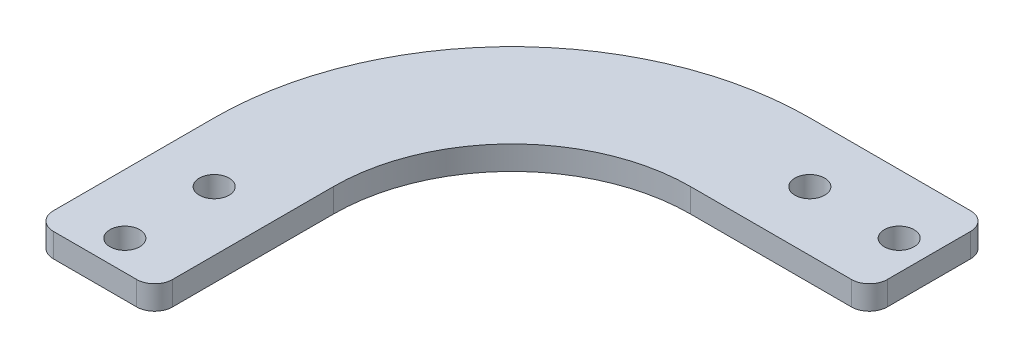
ISO-10303-21;
HEADER;
FILE_DESCRIPTION(('STEP AP214'),'2;1');
FILE_NAME('part.step','',(''),(''),'','','');
FILE_SCHEMA(('AUTOMOTIVE_DESIGN { 1 0 10303 214 1 1 1 1 }'));
ENDSEC;
DATA;
#1=APPLICATION_CONTEXT('core data for automotive mechanical design processes');
#2=APPLICATION_PROTOCOL_DEFINITION('international standard','automotive_design',2000,#1);
#3=PRODUCT_CONTEXT('',#1,'mechanical');
#4=PRODUCT('Part','Part','',(#3));
#5=PRODUCT_RELATED_PRODUCT_CATEGORY('part','',(#4));
#6=PRODUCT_DEFINITION_FORMATION('','',#4);
#7=PRODUCT_DEFINITION_CONTEXT('part definition',#1,'design');
#8=PRODUCT_DEFINITION('design','',#6,#7);
#9=PRODUCT_DEFINITION_SHAPE('','',#8);
#10=(LENGTH_UNIT() NAMED_UNIT(*) SI_UNIT(.MILLI.,.METRE.));
#11=(NAMED_UNIT(*) PLANE_ANGLE_UNIT() SI_UNIT($,.RADIAN.));
#12=(NAMED_UNIT(*) SI_UNIT($,.STERADIAN.) SOLID_ANGLE_UNIT());
#13=UNCERTAINTY_MEASURE_WITH_UNIT(LENGTH_MEASURE(1.E-05),#10,'distance_accuracy_value','');
#14=(GEOMETRIC_REPRESENTATION_CONTEXT(3) GLOBAL_UNCERTAINTY_ASSIGNED_CONTEXT((#13)) GLOBAL_UNIT_ASSIGNED_CONTEXT((#10,
#11,#12)) REPRESENTATION_CONTEXT('',''));
#15=CARTESIAN_POINT('',(0.,0.,0.));
#16=DIRECTION('',(0.,0.,1.));
#17=DIRECTION('',(1.,0.,0.));
#18=AXIS2_PLACEMENT_3D('',#15,#16,#17);
#19=CARTESIAN_POINT('',(0.,4.,0.));
#20=DIRECTION('',(0.,1.,0.));
#21=DIRECTION('',(0.,0.,1.));
#22=AXIS2_PLACEMENT_3D('',#19,#20,#21);
#23=PLANE('',#22);
#24=CARTESIAN_POINT('',(10.,4.,-40.));
#25=DIRECTION('',(0.,1.,0.));
#26=DIRECTION('',(0.,0.,1.));
#27=AXIS2_PLACEMENT_3D('',#24,#25,#26);
#28=CIRCLE('',#27,2.5);
#29=CARTESIAN_POINT('',(10.,4.,-37.5));
#30=VERTEX_POINT('',#29);
#31=EDGE_CURVE('E293',#30,#30,#28,.T.);
#32=ORIENTED_EDGE('',*,*,#31,.F.);
#33=EDGE_LOOP('',(#32));
#34=FACE_BOUND('',#33,.T.);
#35=CARTESIAN_POINT('',(-40.,4.,10.));
#36=DIRECTION('',(0.,1.,0.));
#37=DIRECTION('',(0.,0.,1.));
#38=AXIS2_PLACEMENT_3D('',#35,#36,#37);
#39=CIRCLE('',#38,2.49999999999999);
#40=CARTESIAN_POINT('',(-40.,4.,12.5));
#41=VERTEX_POINT('',#40);
#42=EDGE_CURVE('E160',#41,#41,#39,.T.);
#43=ORIENTED_EDGE('',*,*,#42,.F.);
#44=EDGE_LOOP('',(#43));
#45=FACE_BOUND('',#44,.T.);
#46=CARTESIAN_POINT('',(0.,4.,0.));
#47=DIRECTION('',(0.,1.,0.));
#48=DIRECTION('',(0.,0.,1.));
#49=AXIS2_PLACEMENT_3D('',#46,#47,#48);
#50=CIRCLE('',#49,50.);
#51=CARTESIAN_POINT('',(0.,4.,-50.));
#52=VERTEX_POINT('',#51);
#53=CARTESIAN_POINT('',(-50.,4.,0.));
#54=VERTEX_POINT('',#53);
#55=EDGE_CURVE('E181',#52,#54,#50,.T.);
#56=ORIENTED_EDGE('',*,*,#55,.T.);
#57=DIRECTION('',(0.,0.,1.));
#58=VECTOR('',#57,1.);
#59=CARTESIAN_POINT('',(-50.,4.,0.));
#60=LINE('',#59,#58);
#61=CARTESIAN_POINT('',(-50.,4.,27.));
#62=VERTEX_POINT('',#61);
#63=EDGE_CURVE('E107',#54,#62,#60,.T.);
#64=ORIENTED_EDGE('',*,*,#63,.T.);
#65=CARTESIAN_POINT('',(-47.,4.,27.));
#66=DIRECTION('',(0.,1.,0.));
#67=DIRECTION('',(0.,0.,1.));
#68=AXIS2_PLACEMENT_3D('',#65,#66,#67);
#69=CIRCLE('',#68,3.);
#70=CARTESIAN_POINT('',(-47.,4.,30.));
#71=VERTEX_POINT('',#70);
#72=EDGE_CURVE('E208',#62,#71,#69,.T.);
#73=ORIENTED_EDGE('',*,*,#72,.T.);
#74=DIRECTION('',(1.,0.,0.));
#75=VECTOR('',#74,1.);
#76=CARTESIAN_POINT('',(-47.,4.,30.));
#77=LINE('',#76,#75);
#78=CARTESIAN_POINT('',(-33.,4.,30.));
#79=VERTEX_POINT('',#78);
#80=EDGE_CURVE('E226',#71,#79,#77,.T.);
#81=ORIENTED_EDGE('',*,*,#80,.T.);
#82=CARTESIAN_POINT('',(-33.,4.,27.));
#83=DIRECTION('',(0.,1.,0.));
#84=DIRECTION('',(0.,0.,1.));
#85=AXIS2_PLACEMENT_3D('',#82,#83,#84);
#86=CIRCLE('',#85,3.);
#87=CARTESIAN_POINT('',(-30.,4.,27.));
#88=VERTEX_POINT('',#87);
#89=EDGE_CURVE('E223',#79,#88,#86,.T.);
#90=ORIENTED_EDGE('',*,*,#89,.T.);
#91=DIRECTION('',(0.,0.,-1.));
#92=VECTOR('',#91,1.);
#93=CARTESIAN_POINT('',(-30.,4.,27.));
#94=LINE('',#93,#92);
#95=CARTESIAN_POINT('',(-30.,4.,0.));
#96=VERTEX_POINT('',#95);
#97=EDGE_CURVE('E225',#88,#96,#94,.T.);
#98=ORIENTED_EDGE('',*,*,#97,.T.);
#99=CARTESIAN_POINT('',(0.,4.,0.));
#100=DIRECTION('',(0.,-1.,0.));
#101=DIRECTION('',(0.,0.,1.));
#102=AXIS2_PLACEMENT_3D('',#99,#100,#101);
#103=CIRCLE('',#102,30.);
#104=CARTESIAN_POINT('',(0.,4.,-30.));
#105=VERTEX_POINT('',#104);
#106=EDGE_CURVE('E228',#96,#105,#103,.T.);
#107=ORIENTED_EDGE('',*,*,#106,.T.);
#108=DIRECTION('',(1.,0.,0.));
#109=VECTOR('',#108,1.);
#110=CARTESIAN_POINT('',(0.,4.,-30.));
#111=LINE('',#110,#109);
#112=CARTESIAN_POINT('',(27.,4.,-30.));
#113=VERTEX_POINT('',#112);
#114=EDGE_CURVE('E234',#105,#113,#111,.T.);
#115=ORIENTED_EDGE('',*,*,#114,.T.);
#116=CARTESIAN_POINT('',(27.,4.,-33.));
#117=DIRECTION('',(0.,1.,0.));
#118=DIRECTION('',(0.,0.,-1.));
#119=AXIS2_PLACEMENT_3D('',#116,#117,#118);
#120=CIRCLE('',#119,3.);
#121=CARTESIAN_POINT('',(30.,4.,-33.));
#122=VERTEX_POINT('',#121);
#123=EDGE_CURVE('E138',#113,#122,#120,.T.);
#124=ORIENTED_EDGE('',*,*,#123,.T.);
#125=DIRECTION('',(0.,0.,-1.));
#126=VECTOR('',#125,1.);
#127=CARTESIAN_POINT('',(30.,4.,-47.));
#128=LINE('',#127,#126);
#129=CARTESIAN_POINT('',(30.,4.,-47.));
#130=VERTEX_POINT('',#129);
#131=EDGE_CURVE('E132',#122,#130,#128,.T.);
#132=ORIENTED_EDGE('',*,*,#131,.T.);
#133=CARTESIAN_POINT('',(27.,4.,-47.));
#134=DIRECTION('',(0.,1.,0.));
#135=DIRECTION('',(0.,0.,-1.));
#136=AXIS2_PLACEMENT_3D('',#133,#134,#135);
#137=CIRCLE('',#136,3.);
#138=CARTESIAN_POINT('',(27.,4.,-50.));
#139=VERTEX_POINT('',#138);
#140=EDGE_CURVE('E136',#130,#139,#137,.T.);
#141=ORIENTED_EDGE('',*,*,#140,.T.);
#142=DIRECTION('',(-1.,0.,0.));
#143=VECTOR('',#142,1.);
#144=CARTESIAN_POINT('',(0.,4.,-50.));
#145=LINE('',#144,#143);
#146=EDGE_CURVE('E52',#139,#52,#145,.T.);
#147=ORIENTED_EDGE('',*,*,#146,.T.);
#148=EDGE_LOOP('',(#56,#64,#73,#81,#90,#98,#107,#115,#124,#132,#141,#147));
#149=FACE_BOUND('',#148,.T.);
#150=CARTESIAN_POINT('',(-40.,4.,25.));
#151=DIRECTION('',(0.,1.,0.));
#152=DIRECTION('',(0.,0.,1.));
#153=AXIS2_PLACEMENT_3D('',#150,#151,#152);
#154=CIRCLE('',#153,2.49999999999999);
#155=CARTESIAN_POINT('',(-40.,4.,27.5));
#156=VERTEX_POINT('',#155);
#157=EDGE_CURVE('E299',#156,#156,#154,.T.);
#158=ORIENTED_EDGE('',*,*,#157,.F.);
#159=EDGE_LOOP('',(#158));
#160=FACE_BOUND('',#159,.T.);
#161=CARTESIAN_POINT('',(25.,4.,-40.));
#162=DIRECTION('',(0.,1.,0.));
#163=DIRECTION('',(0.,0.,1.));
#164=AXIS2_PLACEMENT_3D('',#161,#162,#163);
#165=CIRCLE('',#164,2.5);
#166=CARTESIAN_POINT('',(25.,4.,-37.5));
#167=VERTEX_POINT('',#166);
#168=EDGE_CURVE('E284',#167,#167,#165,.T.);
#169=ORIENTED_EDGE('',*,*,#168,.F.);
#170=EDGE_LOOP('',(#169));
#171=FACE_BOUND('',#170,.T.);
#172=ADVANCED_FACE('F35',(#34,#45,#149,#160,#171),#23,.T.);
#173=CARTESIAN_POINT('',(0.,0.,0.));
#174=DIRECTION('',(0.,1.,0.));
#175=DIRECTION('',(0.,0.,1.));
#176=AXIS2_PLACEMENT_3D('',#173,#174,#175);
#177=PLANE('',#176);
#178=CARTESIAN_POINT('',(0.,0.,0.));
#179=DIRECTION('',(0.,1.,0.));
#180=DIRECTION('',(0.,0.,1.));
#181=AXIS2_PLACEMENT_3D('',#178,#179,#180);
#182=CIRCLE('',#181,50.);
#183=CARTESIAN_POINT('',(0.,0.,-50.));
#184=VERTEX_POINT('',#183);
#185=CARTESIAN_POINT('',(-50.,0.,0.));
#186=VERTEX_POINT('',#185);
#187=EDGE_CURVE('E156',#184,#186,#182,.T.);
#188=ORIENTED_EDGE('',*,*,#187,.F.);
#189=DIRECTION('',(-1.,0.,0.));
#190=VECTOR('',#189,1.);
#191=CARTESIAN_POINT('',(0.,0.,-50.));
#192=LINE('',#191,#190);
#193=CARTESIAN_POINT('',(27.,0.,-50.));
#194=VERTEX_POINT('',#193);
#195=EDGE_CURVE('E99',#194,#184,#192,.T.);
#196=ORIENTED_EDGE('',*,*,#195,.F.);
#197=CARTESIAN_POINT('',(27.,0.,-47.));
#198=DIRECTION('',(0.,1.,0.));
#199=DIRECTION('',(0.,0.,-1.));
#200=AXIS2_PLACEMENT_3D('',#197,#198,#199);
#201=CIRCLE('',#200,3.);
#202=CARTESIAN_POINT('',(30.,0.,-47.));
#203=VERTEX_POINT('',#202);
#204=EDGE_CURVE('E93',#203,#194,#201,.T.);
#205=ORIENTED_EDGE('',*,*,#204,.F.);
#206=DIRECTION('',(0.,0.,-1.));
#207=VECTOR('',#206,1.);
#208=CARTESIAN_POINT('',(30.,0.,-47.));
#209=LINE('',#208,#207);
#210=CARTESIAN_POINT('',(30.,0.,-33.));
#211=VERTEX_POINT('',#210);
#212=EDGE_CURVE('E146',#211,#203,#209,.T.);
#213=ORIENTED_EDGE('',*,*,#212,.F.);
#214=CARTESIAN_POINT('',(27.,0.,-33.));
#215=DIRECTION('',(0.,1.,0.));
#216=DIRECTION('',(0.,0.,-1.));
#217=AXIS2_PLACEMENT_3D('',#214,#215,#216);
#218=CIRCLE('',#217,3.);
#219=CARTESIAN_POINT('',(27.,0.,-30.));
#220=VERTEX_POINT('',#219);
#221=EDGE_CURVE('E176',#220,#211,#218,.T.);
#222=ORIENTED_EDGE('',*,*,#221,.F.);
#223=DIRECTION('',(1.,0.,0.));
#224=VECTOR('',#223,1.);
#225=CARTESIAN_POINT('',(27.,0.,-30.));
#226=LINE('',#225,#224);
#227=CARTESIAN_POINT('',(0.,0.,-30.));
#228=VERTEX_POINT('',#227);
#229=EDGE_CURVE('E174',#228,#220,#226,.T.);
#230=ORIENTED_EDGE('',*,*,#229,.F.);
#231=CARTESIAN_POINT('',(0.,0.,0.));
#232=DIRECTION('',(0.,-1.,0.));
#233=DIRECTION('',(0.,0.,1.));
#234=AXIS2_PLACEMENT_3D('',#231,#232,#233);
#235=CIRCLE('',#234,30.);
#236=CARTESIAN_POINT('',(-30.,0.,0.));
#237=VERTEX_POINT('',#236);
#238=EDGE_CURVE('E171',#237,#228,#235,.T.);
#239=ORIENTED_EDGE('',*,*,#238,.F.);
#240=DIRECTION('',(0.,0.,-1.));
#241=VECTOR('',#240,1.);
#242=CARTESIAN_POINT('',(-30.,0.,14.1421356237309));
#243=LINE('',#242,#241);
#244=CARTESIAN_POINT('',(-30.,0.,27.));
#245=VERTEX_POINT('',#244);
#246=EDGE_CURVE('E169',#245,#237,#243,.T.);
#247=ORIENTED_EDGE('',*,*,#246,.F.);
#248=CARTESIAN_POINT('',(-33.,0.,27.));
#249=DIRECTION('',(0.,1.,0.));
#250=DIRECTION('',(0.,0.,1.));
#251=AXIS2_PLACEMENT_3D('',#248,#249,#250);
#252=CIRCLE('',#251,3.);
#253=CARTESIAN_POINT('',(-33.,0.,30.));
#254=VERTEX_POINT('',#253);
#255=EDGE_CURVE('E166',#254,#245,#252,.T.);
#256=ORIENTED_EDGE('',*,*,#255,.F.);
#257=DIRECTION('',(1.,0.,0.));
#258=VECTOR('',#257,1.);
#259=CARTESIAN_POINT('',(-47.,0.,30.));
#260=LINE('',#259,#258);
#261=CARTESIAN_POINT('',(-47.,0.,30.));
#262=VERTEX_POINT('',#261);
#263=EDGE_CURVE('E164',#262,#254,#260,.T.);
#264=ORIENTED_EDGE('',*,*,#263,.F.);
#265=CARTESIAN_POINT('',(-47.,0.,27.));
#266=DIRECTION('',(0.,1.,0.));
#267=DIRECTION('',(0.,0.,1.));
#268=AXIS2_PLACEMENT_3D('',#265,#266,#267);
#269=CIRCLE('',#268,3.);
#270=CARTESIAN_POINT('',(-50.,0.,27.));
#271=VERTEX_POINT('',#270);
#272=EDGE_CURVE('E162',#271,#262,#269,.T.);
#273=ORIENTED_EDGE('',*,*,#272,.F.);
#274=DIRECTION('',(0.,0.,1.));
#275=VECTOR('',#274,1.);
#276=CARTESIAN_POINT('',(-50.,0.,0.));
#277=LINE('',#276,#275);
#278=EDGE_CURVE('E159',#186,#271,#277,.T.);
#279=ORIENTED_EDGE('',*,*,#278,.F.);
#280=EDGE_LOOP('',(#188,#196,#205,#213,#222,#230,#239,#247,#256,#264,#273,#279));
#281=FACE_BOUND('',#280,.T.);
#282=CARTESIAN_POINT('',(-40.,0.,10.));
#283=DIRECTION('',(0.,1.,0.));
#284=DIRECTION('',(0.,0.,1.));
#285=AXIS2_PLACEMENT_3D('',#282,#283,#284);
#286=CIRCLE('',#285,2.49999999999999);
#287=CARTESIAN_POINT('',(-40.,0.,12.5));
#288=VERTEX_POINT('',#287);
#289=EDGE_CURVE('E302',#288,#288,#286,.T.);
#290=ORIENTED_EDGE('',*,*,#289,.T.);
#291=EDGE_LOOP('',(#290));
#292=FACE_BOUND('',#291,.T.);
#293=CARTESIAN_POINT('',(-40.,0.,25.));
#294=DIRECTION('',(0.,1.,0.));
#295=DIRECTION('',(0.,0.,1.));
#296=AXIS2_PLACEMENT_3D('',#293,#294,#295);
#297=CIRCLE('',#296,2.49999999999999);
#298=CARTESIAN_POINT('',(-40.,0.,27.5));
#299=VERTEX_POINT('',#298);
#300=EDGE_CURVE('E296',#299,#299,#297,.T.);
#301=ORIENTED_EDGE('',*,*,#300,.T.);
#302=EDGE_LOOP('',(#301));
#303=FACE_BOUND('',#302,.T.);
#304=CARTESIAN_POINT('',(10.,0.,-40.));
#305=DIRECTION('',(0.,1.,0.));
#306=DIRECTION('',(0.,0.,1.));
#307=AXIS2_PLACEMENT_3D('',#304,#305,#306);
#308=CIRCLE('',#307,2.5);
#309=CARTESIAN_POINT('',(10.,0.,-37.5));
#310=VERTEX_POINT('',#309);
#311=EDGE_CURVE('E290',#310,#310,#308,.T.);
#312=ORIENTED_EDGE('',*,*,#311,.T.);
#313=EDGE_LOOP('',(#312));
#314=FACE_BOUND('',#313,.T.);
#315=CARTESIAN_POINT('',(25.,0.,-40.));
#316=DIRECTION('',(0.,1.,0.));
#317=DIRECTION('',(0.,0.,1.));
#318=AXIS2_PLACEMENT_3D('',#315,#316,#317);
#319=CIRCLE('',#318,2.5);
#320=CARTESIAN_POINT('',(25.,0.,-37.5));
#321=VERTEX_POINT('',#320);
#322=EDGE_CURVE('E287',#321,#321,#319,.T.);
#323=ORIENTED_EDGE('',*,*,#322,.T.);
#324=EDGE_LOOP('',(#323));
#325=FACE_BOUND('',#324,.T.);
#326=ADVANCED_FACE('F212',(#281,#292,#303,#314,#325),#177,.F.);
#327=CARTESIAN_POINT('',(0.,4.,0.));
#328=DIRECTION('',(0.,-1.,0.));
#329=DIRECTION('',(0.,0.,-1.));
#330=AXIS2_PLACEMENT_3D('',#327,#328,#329);
#331=CYLINDRICAL_SURFACE('',#330,50.);
#332=ORIENTED_EDGE('',*,*,#187,.T.);
#333=DIRECTION('',(0.,-1.,0.));
#334=VECTOR('',#333,1.);
#335=CARTESIAN_POINT('',(-50.,4.,0.));
#336=LINE('',#335,#334);
#337=EDGE_CURVE('E11',#54,#186,#336,.T.);
#338=ORIENTED_EDGE('',*,*,#337,.F.);
#339=ORIENTED_EDGE('',*,*,#55,.F.);
#340=DIRECTION('',(0.,-1.,0.));
#341=VECTOR('',#340,1.);
#342=CARTESIAN_POINT('',(0.,4.,-50.));
#343=LINE('',#342,#341);
#344=EDGE_CURVE('E152',#52,#184,#343,.T.);
#345=ORIENTED_EDGE('',*,*,#344,.T.);
#346=EDGE_LOOP('',(#332,#338,#339,#345));
#347=FACE_BOUND('',#346,.T.);
#348=ADVANCED_FACE('F37',(#347),#331,.T.);
#349=CARTESIAN_POINT('',(-50.,4.,0.));
#350=DIRECTION('',(1.,0.,0.));
#351=DIRECTION('',(0.,0.,-1.));
#352=AXIS2_PLACEMENT_3D('',#349,#350,#351);
#353=PLANE('',#352);
#354=ORIENTED_EDGE('',*,*,#278,.T.);
#355=DIRECTION('',(0.,-1.,0.));
#356=VECTOR('',#355,1.);
#357=CARTESIAN_POINT('',(-50.,4.,27.));
#358=LINE('',#357,#356);
#359=EDGE_CURVE('E44',#62,#271,#358,.T.);
#360=ORIENTED_EDGE('',*,*,#359,.F.);
#361=ORIENTED_EDGE('',*,*,#63,.F.);
#362=ORIENTED_EDGE('',*,*,#337,.T.);
#363=EDGE_LOOP('',(#354,#360,#361,#362));
#364=FACE_BOUND('',#363,.T.);
#365=ADVANCED_FACE('F414',(#364),#353,.F.);
#366=CARTESIAN_POINT('',(-47.,4.,27.));
#367=DIRECTION('',(0.,-1.,0.));
#368=DIRECTION('',(0.,0.,-1.));
#369=AXIS2_PLACEMENT_3D('',#366,#367,#368);
#370=CYLINDRICAL_SURFACE('',#369,3.);
#371=ORIENTED_EDGE('',*,*,#272,.T.);
#372=DIRECTION('',(0.,-1.,0.));
#373=VECTOR('',#372,1.);
#374=CARTESIAN_POINT('',(-47.,4.,30.));
#375=LINE('',#374,#373);
#376=EDGE_CURVE('E200',#71,#262,#375,.T.);
#377=ORIENTED_EDGE('',*,*,#376,.F.);
#378=ORIENTED_EDGE('',*,*,#72,.F.);
#379=ORIENTED_EDGE('',*,*,#359,.T.);
#380=EDGE_LOOP('',(#371,#377,#378,#379));
#381=FACE_BOUND('',#380,.T.);
#382=ADVANCED_FACE('F206',(#381),#370,.T.);
#383=CARTESIAN_POINT('',(-47.,4.,30.));
#384=DIRECTION('',(0.,0.,-1.));
#385=DIRECTION('',(-1.,0.,0.));
#386=AXIS2_PLACEMENT_3D('',#383,#384,#385);
#387=PLANE('',#386);
#388=ORIENTED_EDGE('',*,*,#263,.T.);
#389=DIRECTION('',(0.,-1.,0.));
#390=VECTOR('',#389,1.);
#391=CARTESIAN_POINT('',(-33.,4.,30.));
#392=LINE('',#391,#390);
#393=EDGE_CURVE('E197',#79,#254,#392,.T.);
#394=ORIENTED_EDGE('',*,*,#393,.F.);
#395=ORIENTED_EDGE('',*,*,#80,.F.);
#396=ORIENTED_EDGE('',*,*,#376,.T.);
#397=EDGE_LOOP('',(#388,#394,#395,#396));
#398=FACE_BOUND('',#397,.T.);
#399=ADVANCED_FACE('F217',(#398),#387,.F.);
#400=CARTESIAN_POINT('',(-33.,4.,27.));
#401=DIRECTION('',(0.,-1.,0.));
#402=DIRECTION('',(0.,0.,-1.));
#403=AXIS2_PLACEMENT_3D('',#400,#401,#402);
#404=CYLINDRICAL_SURFACE('',#403,3.);
#405=ORIENTED_EDGE('',*,*,#255,.T.);
#406=DIRECTION('',(0.,-1.,0.));
#407=VECTOR('',#406,1.);
#408=CARTESIAN_POINT('',(-30.,4.,27.));
#409=LINE('',#408,#407);
#410=EDGE_CURVE('E194',#88,#245,#409,.T.);
#411=ORIENTED_EDGE('',*,*,#410,.F.);
#412=ORIENTED_EDGE('',*,*,#89,.F.);
#413=ORIENTED_EDGE('',*,*,#393,.T.);
#414=EDGE_LOOP('',(#405,#411,#412,#413));
#415=FACE_BOUND('',#414,.T.);
#416=ADVANCED_FACE('F221',(#415),#404,.T.);
#417=CARTESIAN_POINT('',(-30.,4.,14.1421356237309));
#418=DIRECTION('',(-1.,0.,0.));
#419=DIRECTION('',(0.,0.,1.));
#420=AXIS2_PLACEMENT_3D('',#417,#418,#419);
#421=PLANE('',#420);
#422=ORIENTED_EDGE('',*,*,#246,.T.);
#423=DIRECTION('',(0.,-1.,0.));
#424=VECTOR('',#423,1.);
#425=CARTESIAN_POINT('',(-30.,4.,0.));
#426=LINE('',#425,#424);
#427=EDGE_CURVE('E191',#96,#237,#426,.T.);
#428=ORIENTED_EDGE('',*,*,#427,.F.);
#429=ORIENTED_EDGE('',*,*,#97,.F.);
#430=ORIENTED_EDGE('',*,*,#410,.T.);
#431=EDGE_LOOP('',(#422,#428,#429,#430));
#432=FACE_BOUND('',#431,.T.);
#433=ADVANCED_FACE('F378',(#432),#421,.F.);
#434=CARTESIAN_POINT('',(0.,4.,0.));
#435=DIRECTION('',(0.,-1.,0.));
#436=DIRECTION('',(0.,0.,-1.));
#437=AXIS2_PLACEMENT_3D('',#434,#435,#436);
#438=CYLINDRICAL_SURFACE('',#437,30.);
#439=ORIENTED_EDGE('',*,*,#238,.T.);
#440=DIRECTION('',(0.,-1.,0.));
#441=VECTOR('',#440,1.);
#442=CARTESIAN_POINT('',(0.,4.,-30.));
#443=LINE('',#442,#441);
#444=EDGE_CURVE('E188',#105,#228,#443,.T.);
#445=ORIENTED_EDGE('',*,*,#444,.F.);
#446=ORIENTED_EDGE('',*,*,#106,.F.);
#447=ORIENTED_EDGE('',*,*,#427,.T.);
#448=EDGE_LOOP('',(#439,#445,#446,#447));
#449=FACE_BOUND('',#448,.T.);
#450=ADVANCED_FACE('F368',(#449),#438,.F.);
#451=CARTESIAN_POINT('',(27.,4.,-30.));
#452=DIRECTION('',(0.,0.,-1.));
#453=DIRECTION('',(-1.,0.,0.));
#454=AXIS2_PLACEMENT_3D('',#451,#452,#453);
#455=PLANE('',#454);
#456=ORIENTED_EDGE('',*,*,#229,.T.);
#457=DIRECTION('',(0.,-1.,0.));
#458=VECTOR('',#457,1.);
#459=CARTESIAN_POINT('',(27.,4.,-30.));
#460=LINE('',#459,#458);
#461=EDGE_CURVE('E185',#113,#220,#460,.T.);
#462=ORIENTED_EDGE('',*,*,#461,.F.);
#463=ORIENTED_EDGE('',*,*,#114,.F.);
#464=ORIENTED_EDGE('',*,*,#444,.T.);
#465=EDGE_LOOP('',(#456,#462,#463,#464));
#466=FACE_BOUND('',#465,.T.);
#467=ADVANCED_FACE('F240',(#466),#455,.F.);
#468=CARTESIAN_POINT('',(27.,4.,-33.));
#469=DIRECTION('',(0.,-1.,0.));
#470=DIRECTION('',(0.,0.,-1.));
#471=AXIS2_PLACEMENT_3D('',#468,#469,#470);
#472=CYLINDRICAL_SURFACE('',#471,3.);
#473=ORIENTED_EDGE('',*,*,#221,.T.);
#474=DIRECTION('',(0.,-1.,0.));
#475=VECTOR('',#474,1.);
#476=CARTESIAN_POINT('',(30.,4.,-33.));
#477=LINE('',#476,#475);
#478=EDGE_CURVE('E147',#122,#211,#477,.T.);
#479=ORIENTED_EDGE('',*,*,#478,.F.);
#480=ORIENTED_EDGE('',*,*,#123,.F.);
#481=ORIENTED_EDGE('',*,*,#461,.T.);
#482=EDGE_LOOP('',(#473,#479,#480,#481));
#483=FACE_BOUND('',#482,.T.);
#484=ADVANCED_FACE('F243',(#483),#472,.T.);
#485=CARTESIAN_POINT('',(30.,4.,-47.));
#486=DIRECTION('',(-1.,0.,0.));
#487=DIRECTION('',(0.,0.,1.));
#488=AXIS2_PLACEMENT_3D('',#485,#486,#487);
#489=PLANE('',#488);
#490=ORIENTED_EDGE('',*,*,#212,.T.);
#491=DIRECTION('',(0.,-1.,0.));
#492=VECTOR('',#491,1.);
#493=CARTESIAN_POINT('',(30.,4.,-47.));
#494=LINE('',#493,#492);
#495=EDGE_CURVE('E143',#130,#203,#494,.T.);
#496=ORIENTED_EDGE('',*,*,#495,.F.);
#497=ORIENTED_EDGE('',*,*,#131,.F.);
#498=ORIENTED_EDGE('',*,*,#478,.T.);
#499=EDGE_LOOP('',(#490,#496,#497,#498));
#500=FACE_BOUND('',#499,.T.);
#501=ADVANCED_FACE('F144',(#500),#489,.F.);
#502=CARTESIAN_POINT('',(27.,4.,-47.));
#503=DIRECTION('',(0.,-1.,0.));
#504=DIRECTION('',(0.,0.,-1.));
#505=AXIS2_PLACEMENT_3D('',#502,#503,#504);
#506=CYLINDRICAL_SURFACE('',#505,3.);
#507=ORIENTED_EDGE('',*,*,#204,.T.);
#508=DIRECTION('',(0.,-1.,0.));
#509=VECTOR('',#508,1.);
#510=CARTESIAN_POINT('',(27.,4.,-50.));
#511=LINE('',#510,#509);
#512=EDGE_CURVE('E148',#139,#194,#511,.T.);
#513=ORIENTED_EDGE('',*,*,#512,.F.);
#514=ORIENTED_EDGE('',*,*,#140,.F.);
#515=ORIENTED_EDGE('',*,*,#495,.T.);
#516=EDGE_LOOP('',(#507,#513,#514,#515));
#517=FACE_BOUND('',#516,.T.);
#518=ADVANCED_FACE('F150',(#517),#506,.T.);
#519=CARTESIAN_POINT('',(0.,4.,-50.));
#520=DIRECTION('',(0.,0.,1.));
#521=DIRECTION('',(1.,0.,0.));
#522=AXIS2_PLACEMENT_3D('',#519,#520,#521);
#523=PLANE('',#522);
#524=ORIENTED_EDGE('',*,*,#195,.T.);
#525=ORIENTED_EDGE('',*,*,#344,.F.);
#526=ORIENTED_EDGE('',*,*,#146,.F.);
#527=ORIENTED_EDGE('',*,*,#512,.T.);
#528=EDGE_LOOP('',(#524,#525,#526,#527));
#529=FACE_BOUND('',#528,.T.);
#530=ADVANCED_FACE('F247',(#529),#523,.F.);
#531=CARTESIAN_POINT('',(-40.,4.,10.));
#532=DIRECTION('',(0.,-1.,0.));
#533=DIRECTION('',(0.,0.,-1.));
#534=AXIS2_PLACEMENT_3D('',#531,#532,#533);
#535=CYLINDRICAL_SURFACE('',#534,2.49999999999999);
#536=ORIENTED_EDGE('',*,*,#42,.T.);
#537=EDGE_LOOP('',(#536));
#538=FACE_BOUND('',#537,.T.);
#539=ORIENTED_EDGE('',*,*,#289,.F.);
#540=EDGE_LOOP('',(#539));
#541=FACE_BOUND('',#540,.T.);
#542=ADVANCED_FACE('F249',(#538,#541),#535,.F.);
#543=CARTESIAN_POINT('',(-40.,4.,25.));
#544=DIRECTION('',(0.,-1.,0.));
#545=DIRECTION('',(0.,0.,-1.));
#546=AXIS2_PLACEMENT_3D('',#543,#544,#545);
#547=CYLINDRICAL_SURFACE('',#546,2.49999999999999);
#548=ORIENTED_EDGE('',*,*,#157,.T.);
#549=EDGE_LOOP('',(#548));
#550=FACE_BOUND('',#549,.T.);
#551=ORIENTED_EDGE('',*,*,#300,.F.);
#552=EDGE_LOOP('',(#551));
#553=FACE_BOUND('',#552,.T.);
#554=ADVANCED_FACE('F255',(#550,#553),#547,.F.);
#555=CARTESIAN_POINT('',(10.,4.,-40.));
#556=DIRECTION('',(0.,-1.,0.));
#557=DIRECTION('',(0.,0.,-1.));
#558=AXIS2_PLACEMENT_3D('',#555,#556,#557);
#559=CYLINDRICAL_SURFACE('',#558,2.5);
#560=ORIENTED_EDGE('',*,*,#31,.T.);
#561=EDGE_LOOP('',(#560));
#562=FACE_BOUND('',#561,.T.);
#563=ORIENTED_EDGE('',*,*,#311,.F.);
#564=EDGE_LOOP('',(#563));
#565=FACE_BOUND('',#564,.T.);
#566=ADVANCED_FACE('F271',(#562,#565),#559,.F.);
#567=CARTESIAN_POINT('',(25.,4.,-40.));
#568=DIRECTION('',(0.,-1.,0.));
#569=DIRECTION('',(0.,0.,-1.));
#570=AXIS2_PLACEMENT_3D('',#567,#568,#569);
#571=CYLINDRICAL_SURFACE('',#570,2.5);
#572=ORIENTED_EDGE('',*,*,#168,.T.);
#573=EDGE_LOOP('',(#572));
#574=FACE_BOUND('',#573,.T.);
#575=ORIENTED_EDGE('',*,*,#322,.F.);
#576=EDGE_LOOP('',(#575));
#577=FACE_BOUND('',#576,.T.);
#578=ADVANCED_FACE('F275',(#574,#577),#571,.F.);
#579=CLOSED_SHELL('',(#172,#326,#348,#365,#382,#399,#416,#433,#450,#467,#484,#501,#518,#530,
#542,#554,#566,#578));
#580=MANIFOLD_SOLID_BREP('B2',#579);
#581=ADVANCED_BREP_SHAPE_REPRESENTATION('',(#18,#580),#14);
#582=SHAPE_DEFINITION_REPRESENTATION(#9,#581);
ENDSEC;
END-ISO-10303-21;
